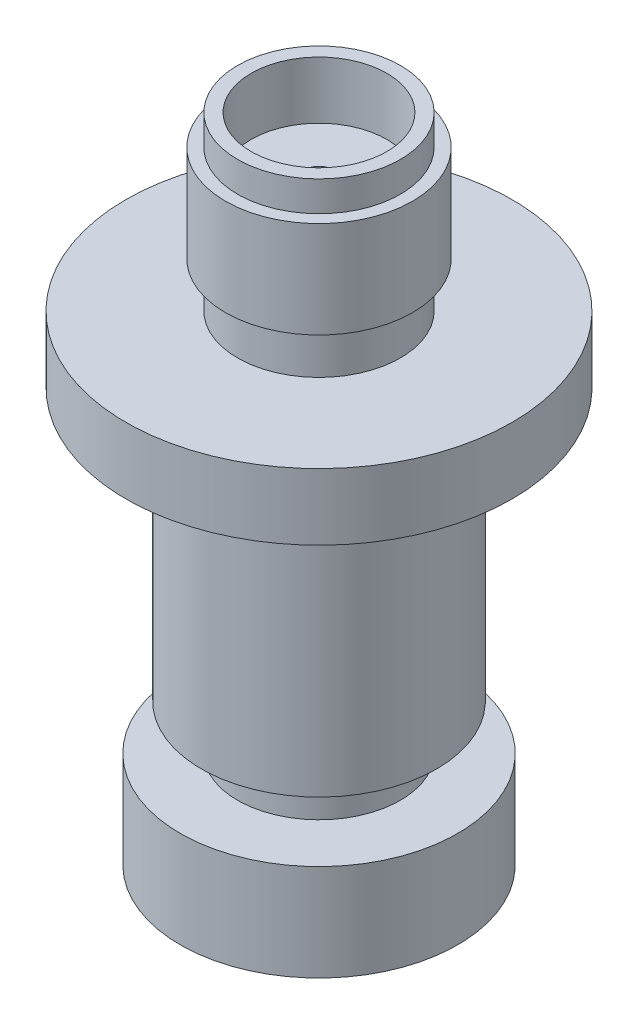
ISO-10303-21;
HEADER;
FILE_DESCRIPTION(('STEP AP214'),'2;1');
FILE_NAME('part.step','',(''),(''),'','','');
FILE_SCHEMA(('AUTOMOTIVE_DESIGN { 1 0 10303 214 1 1 1 1 }'));
ENDSEC;
DATA;
#1=APPLICATION_CONTEXT('core data for automotive mechanical design processes');
#2=APPLICATION_PROTOCOL_DEFINITION('international standard','automotive_design',2000,#1);
#3=PRODUCT_CONTEXT('',#1,'mechanical');
#4=PRODUCT('Part','Part','',(#3));
#5=PRODUCT_RELATED_PRODUCT_CATEGORY('part','',(#4));
#6=PRODUCT_DEFINITION_FORMATION('','',#4);
#7=PRODUCT_DEFINITION_CONTEXT('part definition',#1,'design');
#8=PRODUCT_DEFINITION('design','',#6,#7);
#9=PRODUCT_DEFINITION_SHAPE('','',#8);
#10=(LENGTH_UNIT() NAMED_UNIT(*) SI_UNIT(.MILLI.,.METRE.));
#11=(NAMED_UNIT(*) PLANE_ANGLE_UNIT() SI_UNIT($,.RADIAN.));
#12=(NAMED_UNIT(*) SI_UNIT($,.STERADIAN.) SOLID_ANGLE_UNIT());
#13=UNCERTAINTY_MEASURE_WITH_UNIT(LENGTH_MEASURE(1.E-05),#10,'distance_accuracy_value','');
#14=(GEOMETRIC_REPRESENTATION_CONTEXT(3) GLOBAL_UNCERTAINTY_ASSIGNED_CONTEXT((#13)) GLOBAL_UNIT_ASSIGNED_CONTEXT((#10,
#11,#12)) REPRESENTATION_CONTEXT('',''));
#15=CARTESIAN_POINT('',(0.,0.,0.));
#16=DIRECTION('',(0.,0.,1.));
#17=DIRECTION('',(1.,0.,0.));
#18=AXIS2_PLACEMENT_3D('',#15,#16,#17);
#19=CARTESIAN_POINT('',(0.,16.7,0.));
#20=DIRECTION('',(0.,1.,0.));
#21=DIRECTION('',(1.,0.,0.));
#22=AXIS2_PLACEMENT_3D('',#19,#20,#21);
#23=PLANE('',#22);
#24=CARTESIAN_POINT('',(0.,16.7,0.));
#25=DIRECTION('',(0.,-1.,0.));
#26=DIRECTION('',(1.,0.,0.));
#27=AXIS2_PLACEMENT_3D('',#24,#25,#26);
#28=CIRCLE('',#27,0.5);
#29=CARTESIAN_POINT('',(-0.5,16.7,0.));
#30=VERTEX_POINT('',#29);
#31=EDGE_CURVE('E28',#30,#30,#28,.T.);
#32=ORIENTED_EDGE('',*,*,#31,.F.);
#33=EDGE_LOOP('',(#32));
#34=FACE_BOUND('',#33,.T.);
#35=ADVANCED_FACE('F17',(#34),#23,.T.);
#36=CARTESIAN_POINT('',(0.,-1.13,0.));
#37=DIRECTION('',(0.,1.,0.));
#38=DIRECTION('',(1.,0.,0.));
#39=AXIS2_PLACEMENT_3D('',#36,#37,#38);
#40=CYLINDRICAL_SURFACE('',#39,0.5);
#41=ORIENTED_EDGE('',*,*,#31,.T.);
#42=DIRECTION('',(0.,1.,0.));
#43=VECTOR('',#42,1.);
#44=CARTESIAN_POINT('',(-0.5,-1.13,0.));
#45=LINE('',#44,#43);
#46=CARTESIAN_POINT('',(-0.5,20.7,0.));
#47=VERTEX_POINT('',#46);
#48=EDGE_CURVE('E11',#30,#47,#45,.T.);
#49=ORIENTED_EDGE('',*,*,#48,.T.);
#50=CARTESIAN_POINT('',(0.,20.7,0.));
#51=DIRECTION('',(0.,1.,0.));
#52=DIRECTION('',(1.,0.,0.));
#53=AXIS2_PLACEMENT_3D('',#50,#51,#52);
#54=CIRCLE('',#53,0.5);
#55=EDGE_CURVE('E192',#47,#47,#54,.T.);
#56=ORIENTED_EDGE('',*,*,#55,.T.);
#57=ORIENTED_EDGE('',*,*,#48,.F.);
#58=EDGE_LOOP('',(#41,#49,#56,#57));
#59=FACE_BOUND('',#58,.T.);
#60=ADVANCED_FACE('F309',(#59),#40,.F.);
#61=CARTESIAN_POINT('',(0.,20.7,0.));
#62=DIRECTION('',(0.,1.,0.));
#63=DIRECTION('',(1.,0.,0.));
#64=AXIS2_PLACEMENT_3D('',#61,#62,#63);
#65=PLANE('',#64);
#66=ORIENTED_EDGE('',*,*,#55,.F.);
#67=EDGE_LOOP('',(#66));
#68=FACE_BOUND('',#67,.T.);
#69=CARTESIAN_POINT('',(0.,20.7,0.));
#70=DIRECTION('',(0.,-1.,0.));
#71=DIRECTION('',(1.,0.,0.));
#72=AXIS2_PLACEMENT_3D('',#69,#70,#71);
#73=CIRCLE('',#72,2.25);
#74=CARTESIAN_POINT('',(-2.25,20.7,0.));
#75=VERTEX_POINT('',#74);
#76=EDGE_CURVE('E198',#75,#75,#73,.T.);
#77=ORIENTED_EDGE('',*,*,#76,.F.);
#78=EDGE_LOOP('',(#77));
#79=FACE_BOUND('',#78,.T.);
#80=ADVANCED_FACE('F315',(#68,#79),#65,.T.);
#81=CARTESIAN_POINT('',(0.,-1.13,0.));
#82=DIRECTION('',(0.,1.,0.));
#83=DIRECTION('',(1.,0.,0.));
#84=AXIS2_PLACEMENT_3D('',#81,#82,#83);
#85=CYLINDRICAL_SURFACE('',#84,2.25);
#86=ORIENTED_EDGE('',*,*,#76,.T.);
#87=DIRECTION('',(0.,1.,0.));
#88=VECTOR('',#87,1.);
#89=CARTESIAN_POINT('',(-2.25,-1.13,0.));
#90=LINE('',#89,#88);
#91=CARTESIAN_POINT('',(-2.25,22.6,0.));
#92=VERTEX_POINT('',#91);
#93=EDGE_CURVE('E195',#75,#92,#90,.T.);
#94=ORIENTED_EDGE('',*,*,#93,.T.);
#95=CARTESIAN_POINT('',(0.,22.6,0.));
#96=DIRECTION('',(0.,1.,0.));
#97=DIRECTION('',(1.,0.,0.));
#98=AXIS2_PLACEMENT_3D('',#95,#96,#97);
#99=CIRCLE('',#98,2.25);
#100=EDGE_CURVE('E261',#92,#92,#99,.T.);
#101=ORIENTED_EDGE('',*,*,#100,.T.);
#102=ORIENTED_EDGE('',*,*,#93,.F.);
#103=EDGE_LOOP('',(#86,#94,#101,#102));
#104=FACE_BOUND('',#103,.T.);
#105=ADVANCED_FACE('F323',(#104),#85,.F.);
#106=CARTESIAN_POINT('',(0.,22.6,0.));
#107=DIRECTION('',(0.,1.,0.));
#108=DIRECTION('',(1.,0.,0.));
#109=AXIS2_PLACEMENT_3D('',#106,#107,#108);
#110=PLANE('',#109);
#111=ORIENTED_EDGE('',*,*,#100,.F.);
#112=EDGE_LOOP('',(#111));
#113=FACE_BOUND('',#112,.T.);
#114=CARTESIAN_POINT('',(0.,22.6,0.));
#115=DIRECTION('',(0.,-1.,0.));
#116=DIRECTION('',(1.,0.,0.));
#117=AXIS2_PLACEMENT_3D('',#114,#115,#116);
#118=CIRCLE('',#117,2.7);
#119=CARTESIAN_POINT('',(-2.7,22.6,0.));
#120=VERTEX_POINT('',#119);
#121=EDGE_CURVE('E199',#120,#120,#118,.T.);
#122=ORIENTED_EDGE('',*,*,#121,.F.);
#123=EDGE_LOOP('',(#122));
#124=FACE_BOUND('',#123,.T.);
#125=ADVANCED_FACE('F328',(#113,#124),#110,.T.);
#126=CARTESIAN_POINT('',(0.,-1.13,0.));
#127=DIRECTION('',(0.,1.,0.));
#128=DIRECTION('',(1.,0.,0.));
#129=AXIS2_PLACEMENT_3D('',#126,#127,#128);
#130=CYLINDRICAL_SURFACE('',#129,2.7);
#131=ORIENTED_EDGE('',*,*,#121,.T.);
#132=DIRECTION('',(0.,-1.,0.));
#133=VECTOR('',#132,1.);
#134=CARTESIAN_POINT('',(-2.7,-1.13,0.));
#135=LINE('',#134,#133);
#136=CARTESIAN_POINT('',(-2.7,21.6,0.));
#137=VERTEX_POINT('',#136);
#138=EDGE_CURVE('E203',#120,#137,#135,.T.);
#139=ORIENTED_EDGE('',*,*,#138,.T.);
#140=CARTESIAN_POINT('',(0.,21.6,0.));
#141=DIRECTION('',(0.,1.,0.));
#142=DIRECTION('',(1.,0.,0.));
#143=AXIS2_PLACEMENT_3D('',#140,#141,#142);
#144=CIRCLE('',#143,2.7);
#145=EDGE_CURVE('E204',#137,#137,#144,.T.);
#146=ORIENTED_EDGE('',*,*,#145,.T.);
#147=ORIENTED_EDGE('',*,*,#138,.F.);
#148=EDGE_LOOP('',(#131,#139,#146,#147));
#149=FACE_BOUND('',#148,.T.);
#150=ADVANCED_FACE('F338',(#149),#130,.T.);
#151=CARTESIAN_POINT('',(0.,21.6,0.));
#152=DIRECTION('',(0.,1.,0.));
#153=DIRECTION('',(1.,0.,0.));
#154=AXIS2_PLACEMENT_3D('',#151,#152,#153);
#155=PLANE('',#154);
#156=ORIENTED_EDGE('',*,*,#145,.F.);
#157=EDGE_LOOP('',(#156));
#158=FACE_BOUND('',#157,.T.);
#159=CARTESIAN_POINT('',(0.,21.6,0.));
#160=DIRECTION('',(0.,-1.,0.));
#161=DIRECTION('',(1.,0.,0.));
#162=AXIS2_PLACEMENT_3D('',#159,#160,#161);
#163=CIRCLE('',#162,3.1);
#164=CARTESIAN_POINT('',(-3.1,21.6,0.));
#165=VERTEX_POINT('',#164);
#166=EDGE_CURVE('E227',#165,#165,#163,.T.);
#167=ORIENTED_EDGE('',*,*,#166,.F.);
#168=EDGE_LOOP('',(#167));
#169=FACE_BOUND('',#168,.T.);
#170=ADVANCED_FACE('F344',(#158,#169),#155,.T.);
#171=CARTESIAN_POINT('',(0.,-1.13,0.));
#172=DIRECTION('',(0.,1.,0.));
#173=DIRECTION('',(1.,0.,0.));
#174=AXIS2_PLACEMENT_3D('',#171,#172,#173);
#175=CYLINDRICAL_SURFACE('',#174,3.1);
#176=ORIENTED_EDGE('',*,*,#166,.T.);
#177=DIRECTION('',(0.,-1.,0.));
#178=VECTOR('',#177,1.);
#179=CARTESIAN_POINT('',(-3.1,-1.13,0.));
#180=LINE('',#179,#178);
#181=CARTESIAN_POINT('',(-3.1,18.4,0.));
#182=VERTEX_POINT('',#181);
#183=EDGE_CURVE('E231',#165,#182,#180,.T.);
#184=ORIENTED_EDGE('',*,*,#183,.T.);
#185=CARTESIAN_POINT('',(0.,18.4,0.));
#186=DIRECTION('',(0.,1.,0.));
#187=DIRECTION('',(1.,0.,0.));
#188=AXIS2_PLACEMENT_3D('',#185,#186,#187);
#189=CIRCLE('',#188,3.1);
#190=EDGE_CURVE('E165',#182,#182,#189,.T.);
#191=ORIENTED_EDGE('',*,*,#190,.T.);
#192=ORIENTED_EDGE('',*,*,#183,.F.);
#193=EDGE_LOOP('',(#176,#184,#191,#192));
#194=FACE_BOUND('',#193,.T.);
#195=ADVANCED_FACE('F347',(#194),#175,.T.);
#196=CARTESIAN_POINT('',(0.,18.4,0.));
#197=DIRECTION('',(0.,1.,0.));
#198=DIRECTION('',(1.,0.,0.));
#199=AXIS2_PLACEMENT_3D('',#196,#197,#198);
#200=PLANE('',#199);
#201=CARTESIAN_POINT('',(0.,18.4,0.));
#202=DIRECTION('',(0.,-1.,0.));
#203=DIRECTION('',(1.,0.,0.));
#204=AXIS2_PLACEMENT_3D('',#201,#202,#203);
#205=CIRCLE('',#204,2.7);
#206=CARTESIAN_POINT('',(-2.7,18.4,0.));
#207=VERTEX_POINT('',#206);
#208=EDGE_CURVE('E238',#207,#207,#205,.T.);
#209=ORIENTED_EDGE('',*,*,#208,.F.);
#210=EDGE_LOOP('',(#209));
#211=FACE_BOUND('',#210,.T.);
#212=ORIENTED_EDGE('',*,*,#190,.F.);
#213=EDGE_LOOP('',(#212));
#214=FACE_BOUND('',#213,.T.);
#215=ADVANCED_FACE('F601',(#211,#214),#200,.F.);
#216=CARTESIAN_POINT('',(0.,-1.13,0.));
#217=DIRECTION('',(0.,1.,0.));
#218=DIRECTION('',(1.,0.,0.));
#219=AXIS2_PLACEMENT_3D('',#216,#217,#218);
#220=CYLINDRICAL_SURFACE('',#219,2.7);
#221=ORIENTED_EDGE('',*,*,#208,.T.);
#222=DIRECTION('',(0.,-1.,0.));
#223=VECTOR('',#222,1.);
#224=CARTESIAN_POINT('',(-2.7,-1.13,0.));
#225=LINE('',#224,#223);
#226=CARTESIAN_POINT('',(-2.7,16.9,0.));
#227=VERTEX_POINT('',#226);
#228=EDGE_CURVE('E235',#207,#227,#225,.T.);
#229=ORIENTED_EDGE('',*,*,#228,.T.);
#230=CARTESIAN_POINT('',(0.,16.9,0.));
#231=DIRECTION('',(0.,1.,0.));
#232=DIRECTION('',(1.,0.,0.));
#233=AXIS2_PLACEMENT_3D('',#230,#231,#232);
#234=CIRCLE('',#233,2.7);
#235=EDGE_CURVE('E248',#227,#227,#234,.T.);
#236=ORIENTED_EDGE('',*,*,#235,.T.);
#237=ORIENTED_EDGE('',*,*,#228,.F.);
#238=EDGE_LOOP('',(#221,#229,#236,#237));
#239=FACE_BOUND('',#238,.T.);
#240=ADVANCED_FACE('F591',(#239),#220,.T.);
#241=CARTESIAN_POINT('',(0.,16.9,0.));
#242=DIRECTION('',(0.,1.,0.));
#243=DIRECTION('',(1.,0.,0.));
#244=AXIS2_PLACEMENT_3D('',#241,#242,#243);
#245=PLANE('',#244);
#246=ORIENTED_EDGE('',*,*,#235,.F.);
#247=EDGE_LOOP('',(#246));
#248=FACE_BOUND('',#247,.T.);
#249=CARTESIAN_POINT('',(0.,16.9,0.));
#250=DIRECTION('',(0.,-1.,0.));
#251=DIRECTION('',(1.,0.,0.));
#252=AXIS2_PLACEMENT_3D('',#249,#250,#251);
#253=CIRCLE('',#252,6.4);
#254=CARTESIAN_POINT('',(-6.4,16.9,0.));
#255=VERTEX_POINT('',#254);
#256=EDGE_CURVE('E249',#255,#255,#253,.T.);
#257=ORIENTED_EDGE('',*,*,#256,.F.);
#258=EDGE_LOOP('',(#257));
#259=FACE_BOUND('',#258,.T.);
#260=ADVANCED_FACE('F320',(#248,#259),#245,.T.);
#261=CARTESIAN_POINT('',(0.,-1.13,0.));
#262=DIRECTION('',(0.,1.,0.));
#263=DIRECTION('',(1.,0.,0.));
#264=AXIS2_PLACEMENT_3D('',#261,#262,#263);
#265=CYLINDRICAL_SURFACE('',#264,6.4);
#266=ORIENTED_EDGE('',*,*,#256,.T.);
#267=DIRECTION('',(0.,-1.,0.));
#268=VECTOR('',#267,1.);
#269=CARTESIAN_POINT('',(-6.4,-1.13,0.));
#270=LINE('',#269,#268);
#271=CARTESIAN_POINT('',(-6.4,14.7,0.));
#272=VERTEX_POINT('',#271);
#273=EDGE_CURVE('E245',#255,#272,#270,.T.);
#274=ORIENTED_EDGE('',*,*,#273,.T.);
#275=CARTESIAN_POINT('',(0.,14.7,0.));
#276=DIRECTION('',(0.,1.,0.));
#277=DIRECTION('',(1.,0.,0.));
#278=AXIS2_PLACEMENT_3D('',#275,#276,#277);
#279=CIRCLE('',#278,6.4);
#280=EDGE_CURVE('E250',#272,#272,#279,.T.);
#281=ORIENTED_EDGE('',*,*,#280,.T.);
#282=ORIENTED_EDGE('',*,*,#273,.F.);
#283=EDGE_LOOP('',(#266,#274,#281,#282));
#284=FACE_BOUND('',#283,.T.);
#285=ADVANCED_FACE('F573',(#284),#265,.T.);
#286=CARTESIAN_POINT('',(0.,14.7,0.));
#287=DIRECTION('',(0.,1.,0.));
#288=DIRECTION('',(1.,0.,0.));
#289=AXIS2_PLACEMENT_3D('',#286,#287,#288);
#290=PLANE('',#289);
#291=CARTESIAN_POINT('',(0.,14.7,0.));
#292=DIRECTION('',(0.,-1.,0.));
#293=DIRECTION('',(1.,0.,0.));
#294=AXIS2_PLACEMENT_3D('',#291,#292,#293);
#295=CIRCLE('',#294,5.7);
#296=CARTESIAN_POINT('',(-5.7,14.7,0.));
#297=VERTEX_POINT('',#296);
#298=EDGE_CURVE('E219',#297,#297,#295,.T.);
#299=ORIENTED_EDGE('',*,*,#298,.F.);
#300=EDGE_LOOP('',(#299));
#301=FACE_BOUND('',#300,.T.);
#302=ORIENTED_EDGE('',*,*,#280,.F.);
#303=EDGE_LOOP('',(#302));
#304=FACE_BOUND('',#303,.T.);
#305=ADVANCED_FACE('F563',(#301,#304),#290,.F.);
#306=CARTESIAN_POINT('',(0.,-1.13,0.));
#307=DIRECTION('',(0.,1.,0.));
#308=DIRECTION('',(1.,0.,0.));
#309=AXIS2_PLACEMENT_3D('',#306,#307,#308);
#310=CYLINDRICAL_SURFACE('',#309,5.7);
#311=ORIENTED_EDGE('',*,*,#298,.T.);
#312=DIRECTION('',(0.,1.,0.));
#313=VECTOR('',#312,1.);
#314=CARTESIAN_POINT('',(-5.7,-1.13,0.));
#315=LINE('',#314,#313);
#316=CARTESIAN_POINT('',(-5.7,15.7,0.));
#317=VERTEX_POINT('',#316);
#318=EDGE_CURVE('E223',#297,#317,#315,.T.);
#319=ORIENTED_EDGE('',*,*,#318,.T.);
#320=CARTESIAN_POINT('',(0.,15.7,0.));
#321=DIRECTION('',(0.,1.,0.));
#322=DIRECTION('',(1.,0.,0.));
#323=AXIS2_PLACEMENT_3D('',#320,#321,#322);
#324=CIRCLE('',#323,5.7);
#325=EDGE_CURVE('E211',#317,#317,#324,.T.);
#326=ORIENTED_EDGE('',*,*,#325,.T.);
#327=ORIENTED_EDGE('',*,*,#318,.F.);
#328=EDGE_LOOP('',(#311,#319,#326,#327));
#329=FACE_BOUND('',#328,.T.);
#330=ADVANCED_FACE('F554',(#329),#310,.F.);
#331=CARTESIAN_POINT('',(0.,15.7,0.));
#332=DIRECTION('',(0.,1.,0.));
#333=DIRECTION('',(1.,0.,0.));
#334=AXIS2_PLACEMENT_3D('',#331,#332,#333);
#335=PLANE('',#334);
#336=CARTESIAN_POINT('',(0.,15.7,0.));
#337=DIRECTION('',(0.,-1.,0.));
#338=DIRECTION('',(1.,0.,0.));
#339=AXIS2_PLACEMENT_3D('',#336,#337,#338);
#340=CIRCLE('',#339,3.9);
#341=CARTESIAN_POINT('',(-3.9,15.7,0.));
#342=VERTEX_POINT('',#341);
#343=EDGE_CURVE('E212',#342,#342,#340,.T.);
#344=ORIENTED_EDGE('',*,*,#343,.F.);
#345=EDGE_LOOP('',(#344));
#346=FACE_BOUND('',#345,.T.);
#347=ORIENTED_EDGE('',*,*,#325,.F.);
#348=EDGE_LOOP('',(#347));
#349=FACE_BOUND('',#348,.T.);
#350=ADVANCED_FACE('F19',(#346,#349),#335,.F.);
#351=CARTESIAN_POINT('',(0.,-1.13,0.));
#352=DIRECTION('',(0.,1.,0.));
#353=DIRECTION('',(1.,0.,0.));
#354=AXIS2_PLACEMENT_3D('',#351,#352,#353);
#355=CYLINDRICAL_SURFACE('',#354,3.9);
#356=ORIENTED_EDGE('',*,*,#343,.T.);
#357=DIRECTION('',(0.,-1.,0.));
#358=VECTOR('',#357,1.);
#359=CARTESIAN_POINT('',(-3.9,-1.13,0.));
#360=LINE('',#359,#358);
#361=CARTESIAN_POINT('',(-3.9,5.7,0.));
#362=VERTEX_POINT('',#361);
#363=EDGE_CURVE('E209',#342,#362,#360,.T.);
#364=ORIENTED_EDGE('',*,*,#363,.T.);
#365=CARTESIAN_POINT('',(0.,5.7,0.));
#366=DIRECTION('',(0.,1.,0.));
#367=DIRECTION('',(1.,0.,0.));
#368=AXIS2_PLACEMENT_3D('',#365,#366,#367);
#369=CIRCLE('',#368,3.9);
#370=EDGE_CURVE('E257',#362,#362,#369,.T.);
#371=ORIENTED_EDGE('',*,*,#370,.T.);
#372=ORIENTED_EDGE('',*,*,#363,.F.);
#373=EDGE_LOOP('',(#356,#364,#371,#372));
#374=FACE_BOUND('',#373,.T.);
#375=ADVANCED_FACE('F297',(#374),#355,.T.);
#376=CARTESIAN_POINT('',(0.,5.7,0.));
#377=DIRECTION('',(0.,1.,0.));
#378=DIRECTION('',(1.,0.,0.));
#379=AXIS2_PLACEMENT_3D('',#376,#377,#378);
#380=PLANE('',#379);
#381=CARTESIAN_POINT('',(0.,5.7,0.));
#382=DIRECTION('',(0.,-1.,0.));
#383=DIRECTION('',(1.,0.,0.));
#384=AXIS2_PLACEMENT_3D('',#381,#382,#383);
#385=CIRCLE('',#384,2.7);
#386=CARTESIAN_POINT('',(-2.7,5.7,0.));
#387=VERTEX_POINT('',#386);
#388=EDGE_CURVE('E175',#387,#387,#385,.T.);
#389=ORIENTED_EDGE('',*,*,#388,.F.);
#390=EDGE_LOOP('',(#389));
#391=FACE_BOUND('',#390,.T.);
#392=ORIENTED_EDGE('',*,*,#370,.F.);
#393=EDGE_LOOP('',(#392));
#394=FACE_BOUND('',#393,.T.);
#395=ADVANCED_FACE('F294',(#391,#394),#380,.F.);
#396=CARTESIAN_POINT('',(0.,-1.13,0.));
#397=DIRECTION('',(0.,1.,0.));
#398=DIRECTION('',(1.,0.,0.));
#399=AXIS2_PLACEMENT_3D('',#396,#397,#398);
#400=CYLINDRICAL_SURFACE('',#399,2.7);
#401=ORIENTED_EDGE('',*,*,#388,.T.);
#402=DIRECTION('',(0.,-1.,0.));
#403=VECTOR('',#402,1.);
#404=CARTESIAN_POINT('',(-2.7,-1.13,0.));
#405=LINE('',#404,#403);
#406=CARTESIAN_POINT('',(-2.7,4.2,0.));
#407=VERTEX_POINT('',#406);
#408=EDGE_CURVE('E21',#387,#407,#405,.T.);
#409=ORIENTED_EDGE('',*,*,#408,.T.);
#410=CARTESIAN_POINT('',(0.,4.2,0.));
#411=DIRECTION('',(0.,1.,0.));
#412=DIRECTION('',(1.,0.,0.));
#413=AXIS2_PLACEMENT_3D('',#410,#411,#412);
#414=CIRCLE('',#413,2.7);
#415=EDGE_CURVE('E172',#407,#407,#414,.T.);
#416=ORIENTED_EDGE('',*,*,#415,.T.);
#417=ORIENTED_EDGE('',*,*,#408,.F.);
#418=EDGE_LOOP('',(#401,#409,#416,#417));
#419=FACE_BOUND('',#418,.T.);
#420=ADVANCED_FACE('F291',(#419),#400,.T.);
#421=CARTESIAN_POINT('',(0.,4.2,0.));
#422=DIRECTION('',(0.,1.,0.));
#423=DIRECTION('',(1.,0.,0.));
#424=AXIS2_PLACEMENT_3D('',#421,#422,#423);
#425=PLANE('',#424);
#426=ORIENTED_EDGE('',*,*,#415,.F.);
#427=EDGE_LOOP('',(#426));
#428=FACE_BOUND('',#427,.T.);
#429=CARTESIAN_POINT('',(0.,4.2,0.));
#430=DIRECTION('',(0.,-1.,0.));
#431=DIRECTION('',(1.,0.,0.));
#432=AXIS2_PLACEMENT_3D('',#429,#430,#431);
#433=CIRCLE('',#432,4.6);
#434=CARTESIAN_POINT('',(-4.6,4.2,0.));
#435=VERTEX_POINT('',#434);
#436=EDGE_CURVE('E160',#435,#435,#433,.T.);
#437=ORIENTED_EDGE('',*,*,#436,.F.);
#438=EDGE_LOOP('',(#437));
#439=FACE_BOUND('',#438,.T.);
#440=ADVANCED_FACE('F304',(#428,#439),#425,.T.);
#441=CARTESIAN_POINT('',(0.,-1.13,0.));
#442=DIRECTION('',(0.,1.,0.));
#443=DIRECTION('',(1.,0.,0.));
#444=AXIS2_PLACEMENT_3D('',#441,#442,#443);
#445=CYLINDRICAL_SURFACE('',#444,4.6);
#446=ORIENTED_EDGE('',*,*,#436,.T.);
#447=DIRECTION('',(0.,-1.,0.));
#448=VECTOR('',#447,1.);
#449=CARTESIAN_POINT('',(-4.6,-1.13,0.));
#450=LINE('',#449,#448);
#451=CARTESIAN_POINT('',(-4.6,1.,0.));
#452=VERTEX_POINT('',#451);
#453=EDGE_CURVE('E176',#435,#452,#450,.T.);
#454=ORIENTED_EDGE('',*,*,#453,.T.);
#455=CARTESIAN_POINT('',(0.,1.,0.));
#456=DIRECTION('',(0.,1.,0.));
#457=DIRECTION('',(1.,0.,0.));
#458=AXIS2_PLACEMENT_3D('',#455,#456,#457);
#459=CIRCLE('',#458,4.6);
#460=EDGE_CURVE('E152',#452,#452,#459,.T.);
#461=ORIENTED_EDGE('',*,*,#460,.T.);
#462=ORIENTED_EDGE('',*,*,#453,.F.);
#463=EDGE_LOOP('',(#446,#454,#461,#462));
#464=FACE_BOUND('',#463,.T.);
#465=ADVANCED_FACE('F504',(#464),#445,.T.);
#466=CARTESIAN_POINT('',(0.,1.,0.));
#467=DIRECTION('',(0.,1.,0.));
#468=DIRECTION('',(1.,0.,0.));
#469=AXIS2_PLACEMENT_3D('',#466,#467,#468);
#470=PLANE('',#469);
#471=CARTESIAN_POINT('',(0.,1.,0.));
#472=DIRECTION('',(0.,-1.,0.));
#473=DIRECTION('',(1.,0.,0.));
#474=AXIS2_PLACEMENT_3D('',#471,#472,#473);
#475=CIRCLE('',#474,2.7);
#476=CARTESIAN_POINT('',(-2.7,1.,0.));
#477=VERTEX_POINT('',#476);
#478=EDGE_CURVE('E150',#477,#477,#475,.T.);
#479=ORIENTED_EDGE('',*,*,#478,.F.);
#480=EDGE_LOOP('',(#479));
#481=FACE_BOUND('',#480,.T.);
#482=ORIENTED_EDGE('',*,*,#460,.F.);
#483=EDGE_LOOP('',(#482));
#484=FACE_BOUND('',#483,.T.);
#485=ADVANCED_FACE('F494',(#481,#484),#470,.F.);
#486=CARTESIAN_POINT('',(0.,-1.13,0.));
#487=DIRECTION('',(0.,1.,0.));
#488=DIRECTION('',(1.,0.,0.));
#489=AXIS2_PLACEMENT_3D('',#486,#487,#488);
#490=CYLINDRICAL_SURFACE('',#489,2.7);
#491=ORIENTED_EDGE('',*,*,#478,.T.);
#492=DIRECTION('',(0.,-1.,0.));
#493=VECTOR('',#492,1.);
#494=CARTESIAN_POINT('',(-2.7,-1.13,0.));
#495=LINE('',#494,#493);
#496=CARTESIAN_POINT('',(-2.7,0.,0.));
#497=VERTEX_POINT('',#496);
#498=EDGE_CURVE('E145',#477,#497,#495,.T.);
#499=ORIENTED_EDGE('',*,*,#498,.T.);
#500=CARTESIAN_POINT('',(0.,0.,0.));
#501=DIRECTION('',(0.,1.,0.));
#502=DIRECTION('',(1.,0.,0.));
#503=AXIS2_PLACEMENT_3D('',#500,#501,#502);
#504=CIRCLE('',#503,2.7);
#505=EDGE_CURVE('E148',#497,#497,#504,.T.);
#506=ORIENTED_EDGE('',*,*,#505,.T.);
#507=ORIENTED_EDGE('',*,*,#498,.F.);
#508=EDGE_LOOP('',(#491,#499,#506,#507));
#509=FACE_BOUND('',#508,.T.);
#510=ADVANCED_FACE('F146',(#509),#490,.T.);
#511=CARTESIAN_POINT('',(0.,0.,0.));
#512=DIRECTION('',(0.,1.,0.));
#513=DIRECTION('',(1.,0.,0.));
#514=AXIS2_PLACEMENT_3D('',#511,#512,#513);
#515=PLANE('',#514);
#516=CARTESIAN_POINT('',(0.,0.,0.));
#517=DIRECTION('',(0.,-1.,0.));
#518=DIRECTION('',(1.,0.,0.));
#519=AXIS2_PLACEMENT_3D('',#516,#517,#518);
#520=CIRCLE('',#519,2.25);
#521=CARTESIAN_POINT('',(-2.25,0.,0.));
#522=VERTEX_POINT('',#521);
#523=EDGE_CURVE('E208',#522,#522,#520,.T.);
#524=ORIENTED_EDGE('',*,*,#523,.F.);
#525=EDGE_LOOP('',(#524));
#526=FACE_BOUND('',#525,.T.);
#527=ORIENTED_EDGE('',*,*,#505,.F.);
#528=EDGE_LOOP('',(#527));
#529=FACE_BOUND('',#528,.T.);
#530=ADVANCED_FACE('F472',(#526,#529),#515,.F.);
#531=CARTESIAN_POINT('',(0.,-1.13,0.));
#532=DIRECTION('',(0.,1.,0.));
#533=DIRECTION('',(1.,0.,0.));
#534=AXIS2_PLACEMENT_3D('',#531,#532,#533);
#535=CYLINDRICAL_SURFACE('',#534,2.25);
#536=ORIENTED_EDGE('',*,*,#523,.T.);
#537=DIRECTION('',(0.,1.,0.));
#538=VECTOR('',#537,1.);
#539=CARTESIAN_POINT('',(-2.25,-1.13,0.));
#540=LINE('',#539,#538);
#541=CARTESIAN_POINT('',(-2.25,1.9,0.));
#542=VERTEX_POINT('',#541);
#543=EDGE_CURVE('E138',#522,#542,#540,.T.);
#544=ORIENTED_EDGE('',*,*,#543,.T.);
#545=CARTESIAN_POINT('',(0.,1.9,0.));
#546=DIRECTION('',(0.,1.,0.));
#547=DIRECTION('',(1.,0.,0.));
#548=AXIS2_PLACEMENT_3D('',#545,#546,#547);
#549=CIRCLE('',#548,2.25);
#550=EDGE_CURVE('E205',#542,#542,#549,.T.);
#551=ORIENTED_EDGE('',*,*,#550,.T.);
#552=ORIENTED_EDGE('',*,*,#543,.F.);
#553=EDGE_LOOP('',(#536,#544,#551,#552));
#554=FACE_BOUND('',#553,.T.);
#555=ADVANCED_FACE('F459',(#554),#535,.F.);
#556=CARTESIAN_POINT('',(0.,1.9,0.));
#557=DIRECTION('',(0.,1.,0.));
#558=DIRECTION('',(1.,0.,0.));
#559=AXIS2_PLACEMENT_3D('',#556,#557,#558);
#560=PLANE('',#559);
#561=CARTESIAN_POINT('',(0.,1.9,0.));
#562=DIRECTION('',(0.,-1.,0.));
#563=DIRECTION('',(1.,0.,0.));
#564=AXIS2_PLACEMENT_3D('',#561,#562,#563);
#565=CIRCLE('',#564,0.5);
#566=CARTESIAN_POINT('',(-0.5,1.9,0.));
#567=VERTEX_POINT('',#566);
#568=EDGE_CURVE('E167',#567,#567,#565,.T.);
#569=ORIENTED_EDGE('',*,*,#568,.F.);
#570=EDGE_LOOP('',(#569));
#571=FACE_BOUND('',#570,.T.);
#572=ORIENTED_EDGE('',*,*,#550,.F.);
#573=EDGE_LOOP('',(#572));
#574=FACE_BOUND('',#573,.T.);
#575=ADVANCED_FACE('F446',(#571,#574),#560,.F.);
#576=CARTESIAN_POINT('',(0.,-1.13,0.));
#577=DIRECTION('',(0.,1.,0.));
#578=DIRECTION('',(1.,0.,0.));
#579=AXIS2_PLACEMENT_3D('',#576,#577,#578);
#580=CYLINDRICAL_SURFACE('',#579,0.5);
#581=ORIENTED_EDGE('',*,*,#568,.T.);
#582=DIRECTION('',(0.,1.,0.));
#583=VECTOR('',#582,1.);
#584=CARTESIAN_POINT('',(-0.5,-1.13,0.));
#585=LINE('',#584,#583);
#586=CARTESIAN_POINT('',(-0.5,5.9,0.));
#587=VERTEX_POINT('',#586);
#588=EDGE_CURVE('E170',#567,#587,#585,.T.);
#589=ORIENTED_EDGE('',*,*,#588,.T.);
#590=CARTESIAN_POINT('',(0.,5.9,0.));
#591=DIRECTION('',(0.,-1.,0.));
#592=DIRECTION('',(1.,0.,0.));
#593=AXIS2_PLACEMENT_3D('',#590,#591,#592);
#594=CIRCLE('',#593,0.5);
#595=EDGE_CURVE('E171',#587,#587,#594,.T.);
#596=ORIENTED_EDGE('',*,*,#595,.F.);
#597=ORIENTED_EDGE('',*,*,#588,.F.);
#598=EDGE_LOOP('',(#581,#589,#596,#597));
#599=FACE_BOUND('',#598,.T.);
#600=ADVANCED_FACE('F432',(#599),#580,.F.);
#601=CARTESIAN_POINT('',(0.,5.9,0.));
#602=DIRECTION('',(0.,1.,0.));
#603=DIRECTION('',(1.,0.,0.));
#604=AXIS2_PLACEMENT_3D('',#601,#602,#603);
#605=PLANE('',#604);
#606=ORIENTED_EDGE('',*,*,#595,.T.);
#607=EDGE_LOOP('',(#606));
#608=FACE_BOUND('',#607,.T.);
#609=ADVANCED_FACE('F426',(#608),#605,.F.);
#610=CLOSED_SHELL('',(#35,#60,#80,#105,#125,#150,#170,#195,#215,#240,#260,#285,#305,#330,#350,
#375,#395,#420,#440,#465,#485,#510,#530,#555,#575,#600,#609));
#611=MANIFOLD_SOLID_BREP('B1',#610);
#612=ADVANCED_BREP_SHAPE_REPRESENTATION('',(#18,#611),#14);
#613=SHAPE_DEFINITION_REPRESENTATION(#9,#612);
ENDSEC;
END-ISO-10303-21;
